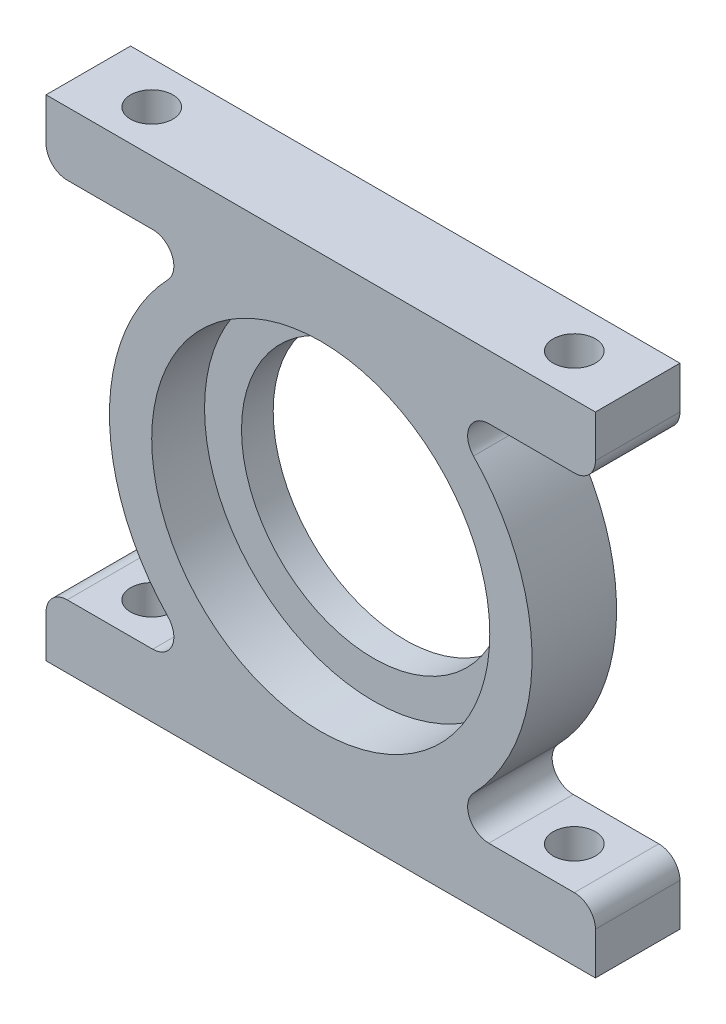
ISO-10303-21;
HEADER;
FILE_DESCRIPTION(('STEP AP214'),'2;1');
FILE_NAME('part.step','',(''),(''),'','','');
FILE_SCHEMA(('AUTOMOTIVE_DESIGN { 1 0 10303 214 1 1 1 1 }'));
ENDSEC;
DATA;
#1=APPLICATION_CONTEXT('core data for automotive mechanical design processes');
#2=APPLICATION_PROTOCOL_DEFINITION('international standard','automotive_design',2000,#1);
#3=PRODUCT_CONTEXT('',#1,'mechanical');
#4=PRODUCT('Part','Part','',(#3));
#5=PRODUCT_RELATED_PRODUCT_CATEGORY('part','',(#4));
#6=PRODUCT_DEFINITION_FORMATION('','',#4);
#7=PRODUCT_DEFINITION_CONTEXT('part definition',#1,'design');
#8=PRODUCT_DEFINITION('design','',#6,#7);
#9=PRODUCT_DEFINITION_SHAPE('','',#8);
#10=(LENGTH_UNIT() NAMED_UNIT(*) SI_UNIT(.MILLI.,.METRE.));
#11=(NAMED_UNIT(*) PLANE_ANGLE_UNIT() SI_UNIT($,.RADIAN.));
#12=(NAMED_UNIT(*) SI_UNIT($,.STERADIAN.) SOLID_ANGLE_UNIT());
#13=UNCERTAINTY_MEASURE_WITH_UNIT(LENGTH_MEASURE(1.E-05),#10,'distance_accuracy_value','');
#14=(GEOMETRIC_REPRESENTATION_CONTEXT(3) GLOBAL_UNCERTAINTY_ASSIGNED_CONTEXT((#13)) GLOBAL_UNIT_ASSIGNED_CONTEXT((#10,
#11,#12)) REPRESENTATION_CONTEXT('',''));
#15=CARTESIAN_POINT('',(0.,0.,0.));
#16=DIRECTION('',(0.,0.,1.));
#17=DIRECTION('',(1.,0.,0.));
#18=AXIS2_PLACEMENT_3D('',#15,#16,#17);
#19=CARTESIAN_POINT('',(0.,0.,8.));
#20=DIRECTION('',(0.,0.,-1.));
#21=DIRECTION('',(-1.,0.,0.));
#22=AXIS2_PLACEMENT_3D('',#19,#20,#21);
#23=CYLINDRICAL_SURFACE('',#22,16.);
#24=CARTESIAN_POINT('',(0.,0.,8.));
#25=DIRECTION('',(0.,0.,1.));
#26=DIRECTION('',(1.,0.,0.));
#27=AXIS2_PLACEMENT_3D('',#24,#25,#26);
#28=CIRCLE('',#27,16.);
#29=CARTESIAN_POINT('',(16.,0.,8.));
#30=VERTEX_POINT('',#29);
#31=EDGE_CURVE('E244',#30,#30,#28,.T.);
#32=ORIENTED_EDGE('',*,*,#31,.T.);
#33=EDGE_LOOP('',(#32));
#34=FACE_BOUND('',#33,.T.);
#35=CARTESIAN_POINT('',(0.,0.,3.));
#36=DIRECTION('',(0.,0.,-1.));
#37=DIRECTION('',(-1.,0.,0.));
#38=AXIS2_PLACEMENT_3D('',#35,#36,#37);
#39=CIRCLE('',#38,16.);
#40=CARTESIAN_POINT('',(-16.,0.,3.));
#41=VERTEX_POINT('',#40);
#42=EDGE_CURVE('E488',#41,#41,#39,.T.);
#43=ORIENTED_EDGE('',*,*,#42,.T.);
#44=EDGE_LOOP('',(#43));
#45=FACE_BOUND('',#44,.T.);
#46=ADVANCED_FACE('F44',(#34,#45),#23,.F.);
#47=CARTESIAN_POINT('',(0.,0.,8.));
#48=DIRECTION('',(0.,0.,1.));
#49=DIRECTION('',(1.,0.,0.));
#50=AXIS2_PLACEMENT_3D('',#47,#48,#49);
#51=PLANE('',#50);
#52=DIRECTION('',(-1.,0.,0.));
#53=VECTOR('',#52,1.);
#54=CARTESIAN_POINT('',(-26.,-17.2,8.));
#55=LINE('',#54,#53);
#56=CARTESIAN_POINT('',(-15.9047162816568,-17.2,8.));
#57=VERTEX_POINT('',#56);
#58=CARTESIAN_POINT('',(-24.,-17.2,8.));
#59=VERTEX_POINT('',#58);
#60=EDGE_CURVE('E229',#57,#59,#55,.T.);
#61=ORIENTED_EDGE('',*,*,#60,.T.);
#62=CARTESIAN_POINT('',(-24.,-19.2,8.));
#63=DIRECTION('',(0.,0.,1.));
#64=DIRECTION('',(1.,0.,0.));
#65=AXIS2_PLACEMENT_3D('',#62,#63,#64);
#66=CIRCLE('',#65,2.);
#67=CARTESIAN_POINT('',(-26.,-19.2,8.));
#68=VERTEX_POINT('',#67);
#69=EDGE_CURVE('E366',#59,#68,#66,.T.);
#70=ORIENTED_EDGE('',*,*,#69,.T.);
#71=DIRECTION('',(0.,-1.,0.));
#72=VECTOR('',#71,1.);
#73=CARTESIAN_POINT('',(-26.,-23.2,8.));
#74=LINE('',#73,#72);
#75=CARTESIAN_POINT('',(-26.,-23.2,8.));
#76=VERTEX_POINT('',#75);
#77=EDGE_CURVE('E226',#68,#76,#74,.T.);
#78=ORIENTED_EDGE('',*,*,#77,.T.);
#79=DIRECTION('',(1.,0.,0.));
#80=VECTOR('',#79,1.);
#81=CARTESIAN_POINT('',(-26.,-23.2,8.));
#82=LINE('',#81,#80);
#83=CARTESIAN_POINT('',(26.,-23.2,8.));
#84=VERTEX_POINT('',#83);
#85=EDGE_CURVE('E231',#76,#84,#82,.T.);
#86=ORIENTED_EDGE('',*,*,#85,.T.);
#87=DIRECTION('',(0.,1.,0.));
#88=VECTOR('',#87,1.);
#89=CARTESIAN_POINT('',(26.,-23.2,8.));
#90=LINE('',#89,#88);
#91=CARTESIAN_POINT('',(26.,-19.2,8.));
#92=VERTEX_POINT('',#91);
#93=EDGE_CURVE('E279',#84,#92,#90,.T.);
#94=ORIENTED_EDGE('',*,*,#93,.T.);
#95=CARTESIAN_POINT('',(24.,-19.2,8.));
#96=DIRECTION('',(0.,0.,1.));
#97=DIRECTION('',(1.,0.,0.));
#98=AXIS2_PLACEMENT_3D('',#95,#96,#97);
#99=CIRCLE('',#98,2.);
#100=CARTESIAN_POINT('',(24.,-17.2,8.));
#101=VERTEX_POINT('',#100);
#102=EDGE_CURVE('E364',#92,#101,#99,.T.);
#103=ORIENTED_EDGE('',*,*,#102,.T.);
#104=DIRECTION('',(-1.,0.,0.));
#105=VECTOR('',#104,1.);
#106=CARTESIAN_POINT('',(26.,-17.2,8.));
#107=LINE('',#106,#105);
#108=CARTESIAN_POINT('',(15.9047162816568,-17.2,8.));
#109=VERTEX_POINT('',#108);
#110=EDGE_CURVE('E434',#101,#109,#107,.T.);
#111=ORIENTED_EDGE('',*,*,#110,.T.);
#112=CARTESIAN_POINT('',(15.9047162816568,-15.2,8.));
#113=DIRECTION('',(0.,0.,1.));
#114=DIRECTION('',(1.,0.,0.));
#115=AXIS2_PLACEMENT_3D('',#112,#113,#114);
#116=CIRCLE('',#115,2.);
#117=CARTESIAN_POINT('',(14.4588329833244,-13.8181818181818,8.));
#118=VERTEX_POINT('',#117);
#119=EDGE_CURVE('E326',#109,#118,#116,.F.);
#120=ORIENTED_EDGE('',*,*,#119,.T.);
#121=CARTESIAN_POINT('',(0.,0.,8.));
#122=DIRECTION('',(0.,0.,1.));
#123=DIRECTION('',(1.,0.,0.));
#124=AXIS2_PLACEMENT_3D('',#121,#122,#123);
#125=CIRCLE('',#124,20.);
#126=CARTESIAN_POINT('',(14.4588329833244,13.8181818181818,8.));
#127=VERTEX_POINT('',#126);
#128=EDGE_CURVE('E451',#118,#127,#125,.T.);
#129=ORIENTED_EDGE('',*,*,#128,.T.);
#130=CARTESIAN_POINT('',(15.9047162816568,15.2,8.));
#131=DIRECTION('',(0.,0.,1.));
#132=DIRECTION('',(1.,0.,0.));
#133=AXIS2_PLACEMENT_3D('',#130,#131,#132);
#134=CIRCLE('',#133,2.);
#135=CARTESIAN_POINT('',(15.9047162816568,17.2,8.));
#136=VERTEX_POINT('',#135);
#137=EDGE_CURVE('E335',#127,#136,#134,.F.);
#138=ORIENTED_EDGE('',*,*,#137,.T.);
#139=DIRECTION('',(1.,0.,0.));
#140=VECTOR('',#139,1.);
#141=CARTESIAN_POINT('',(26.,17.2,8.));
#142=LINE('',#141,#140);
#143=CARTESIAN_POINT('',(24.,17.2,8.));
#144=VERTEX_POINT('',#143);
#145=EDGE_CURVE('E198',#136,#144,#142,.T.);
#146=ORIENTED_EDGE('',*,*,#145,.T.);
#147=CARTESIAN_POINT('',(24.,19.2,8.));
#148=DIRECTION('',(0.,0.,1.));
#149=DIRECTION('',(1.,0.,0.));
#150=AXIS2_PLACEMENT_3D('',#147,#148,#149);
#151=CIRCLE('',#150,2.);
#152=CARTESIAN_POINT('',(26.,19.2,8.));
#153=VERTEX_POINT('',#152);
#154=EDGE_CURVE('E193',#144,#153,#151,.T.);
#155=ORIENTED_EDGE('',*,*,#154,.T.);
#156=DIRECTION('',(0.,1.,0.));
#157=VECTOR('',#156,1.);
#158=CARTESIAN_POINT('',(26.,23.2,8.));
#159=LINE('',#158,#157);
#160=CARTESIAN_POINT('',(26.,23.2,8.));
#161=VERTEX_POINT('',#160);
#162=EDGE_CURVE('E182',#153,#161,#159,.T.);
#163=ORIENTED_EDGE('',*,*,#162,.T.);
#164=DIRECTION('',(-1.,0.,0.));
#165=VECTOR('',#164,1.);
#166=CARTESIAN_POINT('',(-26.,23.2,8.));
#167=LINE('',#166,#165);
#168=CARTESIAN_POINT('',(-26.,23.2,8.));
#169=VERTEX_POINT('',#168);
#170=EDGE_CURVE('E189',#161,#169,#167,.T.);
#171=ORIENTED_EDGE('',*,*,#170,.T.);
#172=DIRECTION('',(0.,-1.,0.));
#173=VECTOR('',#172,1.);
#174=CARTESIAN_POINT('',(-26.,23.2,8.));
#175=LINE('',#174,#173);
#176=CARTESIAN_POINT('',(-26.,19.2,8.));
#177=VERTEX_POINT('',#176);
#178=EDGE_CURVE('E215',#169,#177,#175,.T.);
#179=ORIENTED_EDGE('',*,*,#178,.T.);
#180=CARTESIAN_POINT('',(-24.,19.2,8.));
#181=DIRECTION('',(0.,0.,1.));
#182=DIRECTION('',(1.,0.,0.));
#183=AXIS2_PLACEMENT_3D('',#180,#181,#182);
#184=CIRCLE('',#183,2.);
#185=CARTESIAN_POINT('',(-24.,17.2,8.));
#186=VERTEX_POINT('',#185);
#187=EDGE_CURVE('E63',#177,#186,#184,.T.);
#188=ORIENTED_EDGE('',*,*,#187,.T.);
#189=DIRECTION('',(1.,0.,0.));
#190=VECTOR('',#189,1.);
#191=CARTESIAN_POINT('',(-26.,17.2,8.));
#192=LINE('',#191,#190);
#193=CARTESIAN_POINT('',(-15.9047162816568,17.2,8.));
#194=VERTEX_POINT('',#193);
#195=EDGE_CURVE('E220',#186,#194,#192,.T.);
#196=ORIENTED_EDGE('',*,*,#195,.T.);
#197=CARTESIAN_POINT('',(-15.9047162816568,15.2,8.));
#198=DIRECTION('',(0.,0.,1.));
#199=DIRECTION('',(1.,0.,0.));
#200=AXIS2_PLACEMENT_3D('',#197,#198,#199);
#201=CIRCLE('',#200,2.);
#202=CARTESIAN_POINT('',(-14.4588329833244,13.8181818181818,8.));
#203=VERTEX_POINT('',#202);
#204=EDGE_CURVE('E340',#194,#203,#201,.F.);
#205=ORIENTED_EDGE('',*,*,#204,.T.);
#206=CARTESIAN_POINT('',(0.,0.,8.));
#207=DIRECTION('',(0.,0.,1.));
#208=DIRECTION('',(1.,0.,0.));
#209=AXIS2_PLACEMENT_3D('',#206,#207,#208);
#210=CIRCLE('',#209,20.);
#211=CARTESIAN_POINT('',(-14.4588329833244,-13.8181818181818,8.));
#212=VERTEX_POINT('',#211);
#213=EDGE_CURVE('E224',#203,#212,#210,.T.);
#214=ORIENTED_EDGE('',*,*,#213,.T.);
#215=CARTESIAN_POINT('',(-15.9047162816568,-15.2,8.));
#216=DIRECTION('',(0.,0.,1.));
#217=DIRECTION('',(1.,0.,0.));
#218=AXIS2_PLACEMENT_3D('',#215,#216,#217);
#219=CIRCLE('',#218,2.);
#220=EDGE_CURVE('E317',#212,#57,#219,.F.);
#221=ORIENTED_EDGE('',*,*,#220,.T.);
#222=EDGE_LOOP('',(#61,#70,#78,#86,#94,#103,#111,#120,#129,#138,#146,#155,#163,#171,#179,#188,
#196,#205,#214,#221));
#223=FACE_BOUND('',#222,.T.);
#224=ORIENTED_EDGE('',*,*,#31,.F.);
#225=EDGE_LOOP('',(#224));
#226=FACE_BOUND('',#225,.T.);
#227=ADVANCED_FACE('F184',(#223,#226),#51,.T.);
#228=CARTESIAN_POINT('',(0.,0.,0.));
#229=DIRECTION('',(0.,0.,1.));
#230=DIRECTION('',(1.,0.,0.));
#231=AXIS2_PLACEMENT_3D('',#228,#229,#230);
#232=PLANE('',#231);
#233=DIRECTION('',(0.,-1.,0.));
#234=VECTOR('',#233,1.);
#235=CARTESIAN_POINT('',(-26.,-23.2,0.));
#236=LINE('',#235,#234);
#237=CARTESIAN_POINT('',(-26.,-19.2,0.));
#238=VERTEX_POINT('',#237);
#239=CARTESIAN_POINT('',(-26.,-23.2,0.));
#240=VERTEX_POINT('',#239);
#241=EDGE_CURVE('E275',#238,#240,#236,.T.);
#242=ORIENTED_EDGE('',*,*,#241,.F.);
#243=CARTESIAN_POINT('',(-24.,-19.2,0.));
#244=DIRECTION('',(0.,0.,1.));
#245=DIRECTION('',(1.,0.,0.));
#246=AXIS2_PLACEMENT_3D('',#243,#244,#245);
#247=CIRCLE('',#246,2.);
#248=CARTESIAN_POINT('',(-24.,-17.2,0.));
#249=VERTEX_POINT('',#248);
#250=EDGE_CURVE('E351',#238,#249,#247,.F.);
#251=ORIENTED_EDGE('',*,*,#250,.T.);
#252=DIRECTION('',(-1.,0.,0.));
#253=VECTOR('',#252,1.);
#254=CARTESIAN_POINT('',(-26.,-17.2,0.));
#255=LINE('',#254,#253);
#256=CARTESIAN_POINT('',(-15.9047162816568,-17.2,0.));
#257=VERTEX_POINT('',#256);
#258=EDGE_CURVE('E268',#257,#249,#255,.T.);
#259=ORIENTED_EDGE('',*,*,#258,.F.);
#260=CARTESIAN_POINT('',(-15.9047162816568,-15.2,0.));
#261=DIRECTION('',(0.,0.,1.));
#262=DIRECTION('',(1.,0.,0.));
#263=AXIS2_PLACEMENT_3D('',#260,#261,#262);
#264=CIRCLE('',#263,2.);
#265=CARTESIAN_POINT('',(-14.4588329833244,-13.8181818181818,0.));
#266=VERTEX_POINT('',#265);
#267=EDGE_CURVE('E320',#257,#266,#264,.T.);
#268=ORIENTED_EDGE('',*,*,#267,.T.);
#269=CARTESIAN_POINT('',(0.,0.,0.));
#270=DIRECTION('',(0.,0.,1.));
#271=DIRECTION('',(1.,0.,0.));
#272=AXIS2_PLACEMENT_3D('',#269,#270,#271);
#273=CIRCLE('',#272,20.);
#274=CARTESIAN_POINT('',(-14.4588329833244,13.8181818181818,0.));
#275=VERTEX_POINT('',#274);
#276=EDGE_CURVE('E262',#275,#266,#273,.T.);
#277=ORIENTED_EDGE('',*,*,#276,.F.);
#278=CARTESIAN_POINT('',(-15.9047162816568,15.2,0.));
#279=DIRECTION('',(0.,0.,1.));
#280=DIRECTION('',(1.,0.,0.));
#281=AXIS2_PLACEMENT_3D('',#278,#279,#280);
#282=CIRCLE('',#281,2.);
#283=CARTESIAN_POINT('',(-15.9047162816568,17.2,0.));
#284=VERTEX_POINT('',#283);
#285=EDGE_CURVE('E333',#275,#284,#282,.T.);
#286=ORIENTED_EDGE('',*,*,#285,.T.);
#287=DIRECTION('',(1.,0.,0.));
#288=VECTOR('',#287,1.);
#289=CARTESIAN_POINT('',(-26.,17.2,0.));
#290=LINE('',#289,#288);
#291=CARTESIAN_POINT('',(-24.,17.2,0.));
#292=VERTEX_POINT('',#291);
#293=EDGE_CURVE('E261',#292,#284,#290,.T.);
#294=ORIENTED_EDGE('',*,*,#293,.F.);
#295=CARTESIAN_POINT('',(-24.,19.2,0.));
#296=DIRECTION('',(0.,0.,1.));
#297=DIRECTION('',(1.,0.,0.));
#298=AXIS2_PLACEMENT_3D('',#295,#296,#297);
#299=CIRCLE('',#298,2.);
#300=CARTESIAN_POINT('',(-26.,19.2,0.));
#301=VERTEX_POINT('',#300);
#302=EDGE_CURVE('E347',#292,#301,#299,.F.);
#303=ORIENTED_EDGE('',*,*,#302,.T.);
#304=DIRECTION('',(0.,-1.,0.));
#305=VECTOR('',#304,1.);
#306=CARTESIAN_POINT('',(-26.,23.2,0.));
#307=LINE('',#306,#305);
#308=CARTESIAN_POINT('',(-26.,23.2,0.));
#309=VERTEX_POINT('',#308);
#310=EDGE_CURVE('E256',#309,#301,#307,.T.);
#311=ORIENTED_EDGE('',*,*,#310,.F.);
#312=DIRECTION('',(-1.,0.,0.));
#313=VECTOR('',#312,1.);
#314=CARTESIAN_POINT('',(-26.,23.2,0.));
#315=LINE('',#314,#313);
#316=CARTESIAN_POINT('',(26.,23.2,0.));
#317=VERTEX_POINT('',#316);
#318=EDGE_CURVE('E254',#317,#309,#315,.T.);
#319=ORIENTED_EDGE('',*,*,#318,.F.);
#320=DIRECTION('',(0.,1.,0.));
#321=VECTOR('',#320,1.);
#322=CARTESIAN_POINT('',(26.,23.2,0.));
#323=LINE('',#322,#321);
#324=CARTESIAN_POINT('',(26.,19.2,0.));
#325=VERTEX_POINT('',#324);
#326=EDGE_CURVE('E205',#325,#317,#323,.T.);
#327=ORIENTED_EDGE('',*,*,#326,.F.);
#328=CARTESIAN_POINT('',(24.,19.2,0.));
#329=DIRECTION('',(0.,0.,1.));
#330=DIRECTION('',(1.,0.,0.));
#331=AXIS2_PLACEMENT_3D('',#328,#329,#330);
#332=CIRCLE('',#331,2.);
#333=CARTESIAN_POINT('',(24.,17.2,0.));
#334=VERTEX_POINT('',#333);
#335=EDGE_CURVE('E349',#325,#334,#332,.F.);
#336=ORIENTED_EDGE('',*,*,#335,.T.);
#337=DIRECTION('',(1.,0.,0.));
#338=VECTOR('',#337,1.);
#339=CARTESIAN_POINT('',(26.,17.2,0.));
#340=LINE('',#339,#338);
#341=CARTESIAN_POINT('',(15.9047162816568,17.2,0.));
#342=VERTEX_POINT('',#341);
#343=EDGE_CURVE('E249',#342,#334,#340,.T.);
#344=ORIENTED_EDGE('',*,*,#343,.F.);
#345=CARTESIAN_POINT('',(15.9047162816568,15.2,0.));
#346=DIRECTION('',(0.,0.,1.));
#347=DIRECTION('',(1.,0.,0.));
#348=AXIS2_PLACEMENT_3D('',#345,#346,#347);
#349=CIRCLE('',#348,2.);
#350=CARTESIAN_POINT('',(14.4588329833244,13.8181818181818,0.));
#351=VERTEX_POINT('',#350);
#352=EDGE_CURVE('E328',#342,#351,#349,.T.);
#353=ORIENTED_EDGE('',*,*,#352,.T.);
#354=CARTESIAN_POINT('',(0.,0.,0.));
#355=DIRECTION('',(0.,0.,1.));
#356=DIRECTION('',(1.,0.,0.));
#357=AXIS2_PLACEMENT_3D('',#354,#355,#356);
#358=CIRCLE('',#357,20.);
#359=CARTESIAN_POINT('',(14.4588329833244,-13.8181818181818,0.));
#360=VERTEX_POINT('',#359);
#361=EDGE_CURVE('E241',#360,#351,#358,.T.);
#362=ORIENTED_EDGE('',*,*,#361,.F.);
#363=CARTESIAN_POINT('',(15.9047162816568,-15.2,0.));
#364=DIRECTION('',(0.,0.,1.));
#365=DIRECTION('',(1.,0.,0.));
#366=AXIS2_PLACEMENT_3D('',#363,#364,#365);
#367=CIRCLE('',#366,2.);
#368=CARTESIAN_POINT('',(15.9047162816568,-17.2,0.));
#369=VERTEX_POINT('',#368);
#370=EDGE_CURVE('E325',#360,#369,#367,.T.);
#371=ORIENTED_EDGE('',*,*,#370,.T.);
#372=DIRECTION('',(-1.,0.,0.));
#373=VECTOR('',#372,1.);
#374=CARTESIAN_POINT('',(26.,-17.2,0.));
#375=LINE('',#374,#373);
#376=CARTESIAN_POINT('',(24.,-17.2,0.));
#377=VERTEX_POINT('',#376);
#378=EDGE_CURVE('E243',#377,#369,#375,.T.);
#379=ORIENTED_EDGE('',*,*,#378,.F.);
#380=CARTESIAN_POINT('',(24.,-19.2,0.));
#381=DIRECTION('',(0.,0.,1.));
#382=DIRECTION('',(1.,0.,0.));
#383=AXIS2_PLACEMENT_3D('',#380,#381,#382);
#384=CIRCLE('',#383,2.);
#385=CARTESIAN_POINT('',(26.,-19.2,0.));
#386=VERTEX_POINT('',#385);
#387=EDGE_CURVE('E354',#377,#386,#384,.F.);
#388=ORIENTED_EDGE('',*,*,#387,.T.);
#389=DIRECTION('',(0.,1.,0.));
#390=VECTOR('',#389,1.);
#391=CARTESIAN_POINT('',(26.,-23.2,0.));
#392=LINE('',#391,#390);
#393=CARTESIAN_POINT('',(26.,-23.2,0.));
#394=VERTEX_POINT('',#393);
#395=EDGE_CURVE('E240',#394,#386,#392,.T.);
#396=ORIENTED_EDGE('',*,*,#395,.F.);
#397=DIRECTION('',(1.,0.,0.));
#398=VECTOR('',#397,1.);
#399=CARTESIAN_POINT('',(-26.,-23.2,0.));
#400=LINE('',#399,#398);
#401=EDGE_CURVE('E274',#240,#394,#400,.T.);
#402=ORIENTED_EDGE('',*,*,#401,.F.);
#403=EDGE_LOOP('',(#242,#251,#259,#268,#277,#286,#294,#303,#311,#319,#327,#336,#344,#353,#362,
#371,#379,#388,#396,#402));
#404=FACE_BOUND('',#403,.T.);
#405=CARTESIAN_POINT('',(0.,0.,0.));
#406=DIRECTION('',(0.,0.,-1.));
#407=DIRECTION('',(-1.,0.,0.));
#408=AXIS2_PLACEMENT_3D('',#405,#406,#407);
#409=CIRCLE('',#408,12.5);
#410=CARTESIAN_POINT('',(-12.5,0.,0.));
#411=VERTEX_POINT('',#410);
#412=EDGE_CURVE('E503',#411,#411,#409,.T.);
#413=ORIENTED_EDGE('',*,*,#412,.F.);
#414=EDGE_LOOP('',(#413));
#415=FACE_BOUND('',#414,.T.);
#416=ADVANCED_FACE('F395',(#404,#415),#232,.F.);
#417=CARTESIAN_POINT('',(26.,-23.2,8.));
#418=DIRECTION('',(-1.,0.,0.));
#419=DIRECTION('',(0.,-1.,0.));
#420=AXIS2_PLACEMENT_3D('',#417,#418,#419);
#421=PLANE('',#420);
#422=ORIENTED_EDGE('',*,*,#395,.T.);
#423=DIRECTION('',(0.,0.,-1.));
#424=VECTOR('',#423,1.);
#425=CARTESIAN_POINT('',(26.,-19.2,8.));
#426=LINE('',#425,#424);
#427=EDGE_CURVE('E374',#386,#92,#426,.F.);
#428=ORIENTED_EDGE('',*,*,#427,.T.);
#429=ORIENTED_EDGE('',*,*,#93,.F.);
#430=DIRECTION('',(0.,0.,-1.));
#431=VECTOR('',#430,1.);
#432=CARTESIAN_POINT('',(26.,-23.2,8.));
#433=LINE('',#432,#431);
#434=EDGE_CURVE('E237',#84,#394,#433,.T.);
#435=ORIENTED_EDGE('',*,*,#434,.T.);
#436=EDGE_LOOP('',(#422,#428,#429,#435));
#437=FACE_BOUND('',#436,.T.);
#438=ADVANCED_FACE('F517',(#437),#421,.F.);
#439=CARTESIAN_POINT('',(26.,-17.2,8.));
#440=DIRECTION('',(0.,-1.,0.));
#441=DIRECTION('',(1.,0.,0.));
#442=AXIS2_PLACEMENT_3D('',#439,#440,#441);
#443=PLANE('',#442);
#444=CARTESIAN_POINT('',(20.,-17.2,3.99999999999997));
#445=DIRECTION('',(0.,-1.,0.));
#446=DIRECTION('',(1.,0.,0.));
#447=AXIS2_PLACEMENT_3D('',#444,#445,#446);
#448=CIRCLE('',#447,2.);
#449=CARTESIAN_POINT('',(22.,-17.2,3.99999999999997));
#450=VERTEX_POINT('',#449);
#451=EDGE_CURVE('E472',#450,#450,#448,.T.);
#452=ORIENTED_EDGE('',*,*,#451,.T.);
#453=EDGE_LOOP('',(#452));
#454=FACE_BOUND('',#453,.T.);
#455=ORIENTED_EDGE('',*,*,#110,.F.);
#456=DIRECTION('',(0.,0.,-1.));
#457=VECTOR('',#456,1.);
#458=CARTESIAN_POINT('',(24.,-17.2,8.));
#459=LINE('',#458,#457);
#460=EDGE_CURVE('E371',#101,#377,#459,.T.);
#461=ORIENTED_EDGE('',*,*,#460,.T.);
#462=ORIENTED_EDGE('',*,*,#378,.T.);
#463=DIRECTION('',(0.,0.,1.));
#464=VECTOR('',#463,1.);
#465=CARTESIAN_POINT('',(15.9047162816568,-17.2,8.));
#466=LINE('',#465,#464);
#467=EDGE_CURVE('E302',#369,#109,#466,.T.);
#468=ORIENTED_EDGE('',*,*,#467,.T.);
#469=EDGE_LOOP('',(#455,#461,#462,#468));
#470=FACE_BOUND('',#469,.T.);
#471=ADVANCED_FACE('F444',(#454,#470),#443,.F.);
#472=CARTESIAN_POINT('',(0.,0.,8.));
#473=DIRECTION('',(0.,0.,-1.));
#474=DIRECTION('',(-1.,0.,0.));
#475=AXIS2_PLACEMENT_3D('',#472,#473,#474);
#476=CYLINDRICAL_SURFACE('',#475,20.);
#477=ORIENTED_EDGE('',*,*,#128,.F.);
#478=DIRECTION('',(0.,0.,-1.));
#479=VECTOR('',#478,1.);
#480=CARTESIAN_POINT('',(14.4588329833244,-13.8181818181818,8.));
#481=LINE('',#480,#479);
#482=EDGE_CURVE('E303',#118,#360,#481,.T.);
#483=ORIENTED_EDGE('',*,*,#482,.T.);
#484=ORIENTED_EDGE('',*,*,#361,.T.);
#485=DIRECTION('',(0.,0.,-1.));
#486=VECTOR('',#485,1.);
#487=CARTESIAN_POINT('',(14.4588329833244,13.8181818181818,8.));
#488=LINE('',#487,#486);
#489=EDGE_CURVE('E297',#351,#127,#488,.F.);
#490=ORIENTED_EDGE('',*,*,#489,.T.);
#491=EDGE_LOOP('',(#477,#483,#484,#490));
#492=FACE_BOUND('',#491,.T.);
#493=ADVANCED_FACE('F457',(#492),#476,.T.);
#494=CARTESIAN_POINT('',(26.,17.2,8.));
#495=DIRECTION('',(0.,1.,0.));
#496=DIRECTION('',(0.,0.,1.));
#497=AXIS2_PLACEMENT_3D('',#494,#495,#496);
#498=PLANE('',#497);
#499=CARTESIAN_POINT('',(20.,17.2,3.99999999999997));
#500=DIRECTION('',(0.,1.,0.));
#501=DIRECTION('',(0.,0.,-1.));
#502=AXIS2_PLACEMENT_3D('',#499,#500,#501);
#503=CIRCLE('',#502,2.);
#504=CARTESIAN_POINT('',(20.,17.2,1.99999999999996));
#505=VERTEX_POINT('',#504);
#506=EDGE_CURVE('E473',#505,#505,#503,.T.);
#507=ORIENTED_EDGE('',*,*,#506,.T.);
#508=EDGE_LOOP('',(#507));
#509=FACE_BOUND('',#508,.T.);
#510=ORIENTED_EDGE('',*,*,#343,.T.);
#511=DIRECTION('',(0.,0.,-1.));
#512=VECTOR('',#511,1.);
#513=CARTESIAN_POINT('',(24.,17.2,8.));
#514=LINE('',#513,#512);
#515=EDGE_CURVE('E381',#334,#144,#514,.F.);
#516=ORIENTED_EDGE('',*,*,#515,.T.);
#517=ORIENTED_EDGE('',*,*,#145,.F.);
#518=DIRECTION('',(0.,0.,1.));
#519=VECTOR('',#518,1.);
#520=CARTESIAN_POINT('',(15.9047162816568,17.2,0.));
#521=LINE('',#520,#519);
#522=EDGE_CURVE('E310',#136,#342,#521,.F.);
#523=ORIENTED_EDGE('',*,*,#522,.T.);
#524=EDGE_LOOP('',(#510,#516,#517,#523));
#525=FACE_BOUND('',#524,.T.);
#526=ADVANCED_FACE('F578',(#509,#525),#498,.F.);
#527=CARTESIAN_POINT('',(26.,23.2,8.));
#528=DIRECTION('',(-1.,0.,0.));
#529=DIRECTION('',(0.,0.,1.));
#530=AXIS2_PLACEMENT_3D('',#527,#528,#529);
#531=PLANE('',#530);
#532=ORIENTED_EDGE('',*,*,#162,.F.);
#533=DIRECTION('',(0.,0.,-1.));
#534=VECTOR('',#533,1.);
#535=CARTESIAN_POINT('',(26.,19.2,8.));
#536=LINE('',#535,#534);
#537=EDGE_CURVE('E378',#153,#325,#536,.T.);
#538=ORIENTED_EDGE('',*,*,#537,.T.);
#539=ORIENTED_EDGE('',*,*,#326,.T.);
#540=DIRECTION('',(0.,0.,-1.));
#541=VECTOR('',#540,1.);
#542=CARTESIAN_POINT('',(26.,23.2,8.));
#543=LINE('',#542,#541);
#544=EDGE_CURVE('E200',#161,#317,#543,.T.);
#545=ORIENTED_EDGE('',*,*,#544,.F.);
#546=EDGE_LOOP('',(#532,#538,#539,#545));
#547=FACE_BOUND('',#546,.T.);
#548=ADVANCED_FACE('F199',(#547),#531,.F.);
#549=CARTESIAN_POINT('',(-26.,23.2,8.));
#550=DIRECTION('',(0.,-1.,0.));
#551=DIRECTION('',(0.,0.,-1.));
#552=AXIS2_PLACEMENT_3D('',#549,#550,#551);
#553=PLANE('',#552);
#554=CARTESIAN_POINT('',(-20.,23.2,4.));
#555=DIRECTION('',(0.,1.,0.));
#556=DIRECTION('',(0.,0.,1.));
#557=AXIS2_PLACEMENT_3D('',#554,#555,#556);
#558=CIRCLE('',#557,2.);
#559=CARTESIAN_POINT('',(-20.,23.2,6.));
#560=VERTEX_POINT('',#559);
#561=EDGE_CURVE('E478',#560,#560,#558,.T.);
#562=ORIENTED_EDGE('',*,*,#561,.F.);
#563=EDGE_LOOP('',(#562));
#564=FACE_BOUND('',#563,.T.);
#565=CARTESIAN_POINT('',(20.,23.2,3.99999999999997));
#566=DIRECTION('',(0.,1.,0.));
#567=DIRECTION('',(0.,0.,-1.));
#568=AXIS2_PLACEMENT_3D('',#565,#566,#567);
#569=CIRCLE('',#568,2.);
#570=CARTESIAN_POINT('',(20.,23.2,1.99999999999996));
#571=VERTEX_POINT('',#570);
#572=EDGE_CURVE('E470',#571,#571,#569,.T.);
#573=ORIENTED_EDGE('',*,*,#572,.F.);
#574=EDGE_LOOP('',(#573));
#575=FACE_BOUND('',#574,.T.);
#576=ORIENTED_EDGE('',*,*,#318,.T.);
#577=DIRECTION('',(0.,0.,-1.));
#578=VECTOR('',#577,1.);
#579=CARTESIAN_POINT('',(-26.,23.2,8.));
#580=LINE('',#579,#578);
#581=EDGE_CURVE('E210',#169,#309,#580,.T.);
#582=ORIENTED_EDGE('',*,*,#581,.F.);
#583=ORIENTED_EDGE('',*,*,#170,.F.);
#584=ORIENTED_EDGE('',*,*,#544,.T.);
#585=EDGE_LOOP('',(#576,#582,#583,#584));
#586=FACE_BOUND('',#585,.T.);
#587=ADVANCED_FACE('F207',(#564,#575,#586),#553,.F.);
#588=CARTESIAN_POINT('',(-26.,23.2,8.));
#589=DIRECTION('',(1.,0.,0.));
#590=DIRECTION('',(0.,0.,-1.));
#591=AXIS2_PLACEMENT_3D('',#588,#589,#590);
#592=PLANE('',#591);
#593=ORIENTED_EDGE('',*,*,#310,.T.);
#594=DIRECTION('',(0.,0.,-1.));
#595=VECTOR('',#594,1.);
#596=CARTESIAN_POINT('',(-26.,19.2,8.));
#597=LINE('',#596,#595);
#598=EDGE_CURVE('E11',#301,#177,#597,.F.);
#599=ORIENTED_EDGE('',*,*,#598,.T.);
#600=ORIENTED_EDGE('',*,*,#178,.F.);
#601=ORIENTED_EDGE('',*,*,#581,.T.);
#602=EDGE_LOOP('',(#593,#599,#600,#601));
#603=FACE_BOUND('',#602,.T.);
#604=ADVANCED_FACE('F585',(#603),#592,.F.);
#605=CARTESIAN_POINT('',(-26.,17.2,8.));
#606=DIRECTION('',(0.,1.,0.));
#607=DIRECTION('',(0.,0.,1.));
#608=AXIS2_PLACEMENT_3D('',#605,#606,#607);
#609=PLANE('',#608);
#610=CARTESIAN_POINT('',(-20.,17.2,4.));
#611=DIRECTION('',(0.,1.,0.));
#612=DIRECTION('',(0.,0.,1.));
#613=AXIS2_PLACEMENT_3D('',#610,#611,#612);
#614=CIRCLE('',#613,2.);
#615=CARTESIAN_POINT('',(-20.,17.2,6.));
#616=VERTEX_POINT('',#615);
#617=EDGE_CURVE('E468',#616,#616,#614,.T.);
#618=ORIENTED_EDGE('',*,*,#617,.T.);
#619=EDGE_LOOP('',(#618));
#620=FACE_BOUND('',#619,.T.);
#621=ORIENTED_EDGE('',*,*,#195,.F.);
#622=DIRECTION('',(0.,0.,-1.));
#623=VECTOR('',#622,1.);
#624=CARTESIAN_POINT('',(-24.,17.2,8.));
#625=LINE('',#624,#623);
#626=EDGE_CURVE('E53',#186,#292,#625,.T.);
#627=ORIENTED_EDGE('',*,*,#626,.T.);
#628=ORIENTED_EDGE('',*,*,#293,.T.);
#629=DIRECTION('',(0.,0.,1.));
#630=VECTOR('',#629,1.);
#631=CARTESIAN_POINT('',(-15.9047162816568,17.2,8.));
#632=LINE('',#631,#630);
#633=EDGE_CURVE('E311',#284,#194,#632,.T.);
#634=ORIENTED_EDGE('',*,*,#633,.T.);
#635=EDGE_LOOP('',(#621,#627,#628,#634));
#636=FACE_BOUND('',#635,.T.);
#637=ADVANCED_FACE('F388',(#620,#636),#609,.F.);
#638=CARTESIAN_POINT('',(0.,0.,8.));
#639=DIRECTION('',(0.,0.,-1.));
#640=DIRECTION('',(-1.,0.,0.));
#641=AXIS2_PLACEMENT_3D('',#638,#639,#640);
#642=CYLINDRICAL_SURFACE('',#641,20.);
#643=ORIENTED_EDGE('',*,*,#276,.T.);
#644=DIRECTION('',(0.,0.,-1.));
#645=VECTOR('',#644,1.);
#646=CARTESIAN_POINT('',(-14.4588329833244,-13.8181818181818,8.));
#647=LINE('',#646,#645);
#648=EDGE_CURVE('E293',#266,#212,#647,.F.);
#649=ORIENTED_EDGE('',*,*,#648,.T.);
#650=ORIENTED_EDGE('',*,*,#213,.F.);
#651=DIRECTION('',(0.,0.,-1.));
#652=VECTOR('',#651,1.);
#653=CARTESIAN_POINT('',(-14.4588329833244,13.8181818181818,8.));
#654=LINE('',#653,#652);
#655=EDGE_CURVE('E292',#203,#275,#654,.T.);
#656=ORIENTED_EDGE('',*,*,#655,.T.);
#657=EDGE_LOOP('',(#643,#649,#650,#656));
#658=FACE_BOUND('',#657,.T.);
#659=ADVANCED_FACE('F408',(#658),#642,.T.);
#660=CARTESIAN_POINT('',(-26.,-17.2,8.));
#661=DIRECTION('',(0.,-1.,0.));
#662=DIRECTION('',(1.,0.,0.));
#663=AXIS2_PLACEMENT_3D('',#660,#661,#662);
#664=PLANE('',#663);
#665=CARTESIAN_POINT('',(-20.,-17.2,4.));
#666=DIRECTION('',(0.,-1.,0.));
#667=DIRECTION('',(1.,0.,0.));
#668=AXIS2_PLACEMENT_3D('',#665,#666,#667);
#669=CIRCLE('',#668,2.);
#670=CARTESIAN_POINT('',(-18.,-17.2,4.));
#671=VERTEX_POINT('',#670);
#672=EDGE_CURVE('E490',#671,#671,#669,.T.);
#673=ORIENTED_EDGE('',*,*,#672,.T.);
#674=EDGE_LOOP('',(#673));
#675=FACE_BOUND('',#674,.T.);
#676=ORIENTED_EDGE('',*,*,#258,.T.);
#677=DIRECTION('',(0.,0.,-1.));
#678=VECTOR('',#677,1.);
#679=CARTESIAN_POINT('',(-24.,-17.2,8.));
#680=LINE('',#679,#678);
#681=EDGE_CURVE('E356',#249,#59,#680,.F.);
#682=ORIENTED_EDGE('',*,*,#681,.T.);
#683=ORIENTED_EDGE('',*,*,#60,.F.);
#684=DIRECTION('',(0.,0.,1.));
#685=VECTOR('',#684,1.);
#686=CARTESIAN_POINT('',(-15.9047162816568,-17.2,0.));
#687=LINE('',#686,#685);
#688=EDGE_CURVE('E206',#57,#257,#687,.F.);
#689=ORIENTED_EDGE('',*,*,#688,.T.);
#690=EDGE_LOOP('',(#676,#682,#683,#689));
#691=FACE_BOUND('',#690,.T.);
#692=ADVANCED_FACE('F414',(#675,#691),#664,.F.);
#693=CARTESIAN_POINT('',(-26.,-23.2,8.));
#694=DIRECTION('',(1.,0.,0.));
#695=DIRECTION('',(0.,1.,0.));
#696=AXIS2_PLACEMENT_3D('',#693,#694,#695);
#697=PLANE('',#696);
#698=ORIENTED_EDGE('',*,*,#77,.F.);
#699=DIRECTION('',(0.,0.,-1.));
#700=VECTOR('',#699,1.);
#701=CARTESIAN_POINT('',(-26.,-19.2,8.));
#702=LINE('',#701,#700);
#703=EDGE_CURVE('E345',#68,#238,#702,.T.);
#704=ORIENTED_EDGE('',*,*,#703,.T.);
#705=ORIENTED_EDGE('',*,*,#241,.T.);
#706=DIRECTION('',(0.,0.,-1.));
#707=VECTOR('',#706,1.);
#708=CARTESIAN_POINT('',(-26.,-23.2,8.));
#709=LINE('',#708,#707);
#710=EDGE_CURVE('E284',#76,#240,#709,.T.);
#711=ORIENTED_EDGE('',*,*,#710,.F.);
#712=EDGE_LOOP('',(#698,#704,#705,#711));
#713=FACE_BOUND('',#712,.T.);
#714=ADVANCED_FACE('F421',(#713),#697,.F.);
#715=CARTESIAN_POINT('',(-26.,-23.2,8.));
#716=DIRECTION('',(0.,1.,0.));
#717=DIRECTION('',(-1.,0.,0.));
#718=AXIS2_PLACEMENT_3D('',#715,#716,#717);
#719=PLANE('',#718);
#720=CARTESIAN_POINT('',(20.,-23.2,3.99999999999997));
#721=DIRECTION('',(0.,-1.,0.));
#722=DIRECTION('',(1.,0.,0.));
#723=AXIS2_PLACEMENT_3D('',#720,#721,#722);
#724=CIRCLE('',#723,2.);
#725=CARTESIAN_POINT('',(22.,-23.2,3.99999999999997));
#726=VERTEX_POINT('',#725);
#727=EDGE_CURVE('E495',#726,#726,#724,.T.);
#728=ORIENTED_EDGE('',*,*,#727,.F.);
#729=EDGE_LOOP('',(#728));
#730=FACE_BOUND('',#729,.T.);
#731=CARTESIAN_POINT('',(-20.,-23.2,4.));
#732=DIRECTION('',(0.,-1.,0.));
#733=DIRECTION('',(1.,0.,0.));
#734=AXIS2_PLACEMENT_3D('',#731,#732,#733);
#735=CIRCLE('',#734,2.);
#736=CARTESIAN_POINT('',(-18.,-23.2,4.));
#737=VERTEX_POINT('',#736);
#738=EDGE_CURVE('E483',#737,#737,#735,.T.);
#739=ORIENTED_EDGE('',*,*,#738,.F.);
#740=EDGE_LOOP('',(#739));
#741=FACE_BOUND('',#740,.T.);
#742=ORIENTED_EDGE('',*,*,#401,.T.);
#743=ORIENTED_EDGE('',*,*,#434,.F.);
#744=ORIENTED_EDGE('',*,*,#85,.F.);
#745=ORIENTED_EDGE('',*,*,#710,.T.);
#746=EDGE_LOOP('',(#742,#743,#744,#745));
#747=FACE_BOUND('',#746,.T.);
#748=ADVANCED_FACE('F428',(#730,#741,#747),#719,.F.);
#749=CARTESIAN_POINT('',(-20.,17.2,4.));
#750=DIRECTION('',(0.,1.,0.));
#751=DIRECTION('',(0.,0.,1.));
#752=AXIS2_PLACEMENT_3D('',#749,#750,#751);
#753=CYLINDRICAL_SURFACE('',#752,2.);
#754=ORIENTED_EDGE('',*,*,#617,.F.);
#755=EDGE_LOOP('',(#754));
#756=FACE_BOUND('',#755,.T.);
#757=ORIENTED_EDGE('',*,*,#561,.T.);
#758=EDGE_LOOP('',(#757));
#759=FACE_BOUND('',#758,.T.);
#760=ADVANCED_FACE('F536',(#756,#759),#753,.F.);
#761=CARTESIAN_POINT('',(20.,17.2,3.99999999999997));
#762=DIRECTION('',(0.,1.,0.));
#763=DIRECTION('',(0.,0.,1.));
#764=AXIS2_PLACEMENT_3D('',#761,#762,#763);
#765=CYLINDRICAL_SURFACE('',#764,2.);
#766=ORIENTED_EDGE('',*,*,#506,.F.);
#767=EDGE_LOOP('',(#766));
#768=FACE_BOUND('',#767,.T.);
#769=ORIENTED_EDGE('',*,*,#572,.T.);
#770=EDGE_LOOP('',(#769));
#771=FACE_BOUND('',#770,.T.);
#772=ADVANCED_FACE('F535',(#768,#771),#765,.F.);
#773=CARTESIAN_POINT('',(-20.,-17.2,4.));
#774=DIRECTION('',(0.,-1.,0.));
#775=DIRECTION('',(1.,0.,0.));
#776=AXIS2_PLACEMENT_3D('',#773,#774,#775);
#777=CYLINDRICAL_SURFACE('',#776,2.);
#778=ORIENTED_EDGE('',*,*,#672,.F.);
#779=EDGE_LOOP('',(#778));
#780=FACE_BOUND('',#779,.T.);
#781=ORIENTED_EDGE('',*,*,#738,.T.);
#782=EDGE_LOOP('',(#781));
#783=FACE_BOUND('',#782,.T.);
#784=ADVANCED_FACE('F532',(#780,#783),#777,.F.);
#785=CARTESIAN_POINT('',(20.,-17.2,3.99999999999997));
#786=DIRECTION('',(0.,-1.,0.));
#787=DIRECTION('',(1.,0.,0.));
#788=AXIS2_PLACEMENT_3D('',#785,#786,#787);
#789=CYLINDRICAL_SURFACE('',#788,2.);
#790=ORIENTED_EDGE('',*,*,#451,.F.);
#791=EDGE_LOOP('',(#790));
#792=FACE_BOUND('',#791,.T.);
#793=ORIENTED_EDGE('',*,*,#727,.T.);
#794=EDGE_LOOP('',(#793));
#795=FACE_BOUND('',#794,.T.);
#796=ADVANCED_FACE('F543',(#792,#795),#789,.F.);
#797=CARTESIAN_POINT('',(-15.9047162816568,-15.2,8.));
#798=DIRECTION('',(0.,0.,-1.));
#799=DIRECTION('',(-1.,0.,0.));
#800=AXIS2_PLACEMENT_3D('',#797,#798,#799);
#801=CYLINDRICAL_SURFACE('',#800,2.);
#802=ORIENTED_EDGE('',*,*,#220,.F.);
#803=ORIENTED_EDGE('',*,*,#648,.F.);
#804=ORIENTED_EDGE('',*,*,#267,.F.);
#805=ORIENTED_EDGE('',*,*,#688,.F.);
#806=EDGE_LOOP('',(#802,#803,#804,#805));
#807=FACE_BOUND('',#806,.T.);
#808=ADVANCED_FACE('F410',(#807),#801,.F.);
#809=CARTESIAN_POINT('',(15.9047162816568,-15.2,8.));
#810=DIRECTION('',(0.,0.,-1.));
#811=DIRECTION('',(-1.,0.,0.));
#812=AXIS2_PLACEMENT_3D('',#809,#810,#811);
#813=CYLINDRICAL_SURFACE('',#812,2.);
#814=ORIENTED_EDGE('',*,*,#119,.F.);
#815=ORIENTED_EDGE('',*,*,#467,.F.);
#816=ORIENTED_EDGE('',*,*,#370,.F.);
#817=ORIENTED_EDGE('',*,*,#482,.F.);
#818=EDGE_LOOP('',(#814,#815,#816,#817));
#819=FACE_BOUND('',#818,.T.);
#820=ADVANCED_FACE('F446',(#819),#813,.F.);
#821=CARTESIAN_POINT('',(15.9047162816568,15.2,8.));
#822=DIRECTION('',(0.,0.,-1.));
#823=DIRECTION('',(-1.,0.,0.));
#824=AXIS2_PLACEMENT_3D('',#821,#822,#823);
#825=CYLINDRICAL_SURFACE('',#824,2.);
#826=ORIENTED_EDGE('',*,*,#137,.F.);
#827=ORIENTED_EDGE('',*,*,#489,.F.);
#828=ORIENTED_EDGE('',*,*,#352,.F.);
#829=ORIENTED_EDGE('',*,*,#522,.F.);
#830=EDGE_LOOP('',(#826,#827,#828,#829));
#831=FACE_BOUND('',#830,.T.);
#832=ADVANCED_FACE('F561',(#831),#825,.F.);
#833=CARTESIAN_POINT('',(-15.9047162816568,15.2,8.));
#834=DIRECTION('',(0.,0.,-1.));
#835=DIRECTION('',(-1.,0.,0.));
#836=AXIS2_PLACEMENT_3D('',#833,#834,#835);
#837=CYLINDRICAL_SURFACE('',#836,2.);
#838=ORIENTED_EDGE('',*,*,#204,.F.);
#839=ORIENTED_EDGE('',*,*,#633,.F.);
#840=ORIENTED_EDGE('',*,*,#285,.F.);
#841=ORIENTED_EDGE('',*,*,#655,.F.);
#842=EDGE_LOOP('',(#838,#839,#840,#841));
#843=FACE_BOUND('',#842,.T.);
#844=ADVANCED_FACE('F405',(#843),#837,.F.);
#845=CARTESIAN_POINT('',(-24.,-19.2,8.));
#846=DIRECTION('',(0.,0.,-1.));
#847=DIRECTION('',(-1.,0.,0.));
#848=AXIS2_PLACEMENT_3D('',#845,#846,#847);
#849=CYLINDRICAL_SURFACE('',#848,2.);
#850=ORIENTED_EDGE('',*,*,#69,.F.);
#851=ORIENTED_EDGE('',*,*,#681,.F.);
#852=ORIENTED_EDGE('',*,*,#250,.F.);
#853=ORIENTED_EDGE('',*,*,#703,.F.);
#854=EDGE_LOOP('',(#850,#851,#852,#853));
#855=FACE_BOUND('',#854,.T.);
#856=ADVANCED_FACE('F416',(#855),#849,.T.);
#857=CARTESIAN_POINT('',(24.,-19.2,8.));
#858=DIRECTION('',(0.,0.,-1.));
#859=DIRECTION('',(-1.,0.,0.));
#860=AXIS2_PLACEMENT_3D('',#857,#858,#859);
#861=CYLINDRICAL_SURFACE('',#860,2.);
#862=ORIENTED_EDGE('',*,*,#102,.F.);
#863=ORIENTED_EDGE('',*,*,#427,.F.);
#864=ORIENTED_EDGE('',*,*,#387,.F.);
#865=ORIENTED_EDGE('',*,*,#460,.F.);
#866=EDGE_LOOP('',(#862,#863,#864,#865));
#867=FACE_BOUND('',#866,.T.);
#868=ADVANCED_FACE('F439',(#867),#861,.T.);
#869=CARTESIAN_POINT('',(24.,19.2,8.));
#870=DIRECTION('',(0.,0.,-1.));
#871=DIRECTION('',(-1.,0.,0.));
#872=AXIS2_PLACEMENT_3D('',#869,#870,#871);
#873=CYLINDRICAL_SURFACE('',#872,2.);
#874=ORIENTED_EDGE('',*,*,#154,.F.);
#875=ORIENTED_EDGE('',*,*,#515,.F.);
#876=ORIENTED_EDGE('',*,*,#335,.F.);
#877=ORIENTED_EDGE('',*,*,#537,.F.);
#878=EDGE_LOOP('',(#874,#875,#876,#877));
#879=FACE_BOUND('',#878,.T.);
#880=ADVANCED_FACE('F552',(#879),#873,.T.);
#881=CARTESIAN_POINT('',(-24.,19.2,8.));
#882=DIRECTION('',(0.,0.,-1.));
#883=DIRECTION('',(-1.,0.,0.));
#884=AXIS2_PLACEMENT_3D('',#881,#882,#883);
#885=CYLINDRICAL_SURFACE('',#884,2.);
#886=ORIENTED_EDGE('',*,*,#187,.F.);
#887=ORIENTED_EDGE('',*,*,#598,.F.);
#888=ORIENTED_EDGE('',*,*,#302,.F.);
#889=ORIENTED_EDGE('',*,*,#626,.F.);
#890=EDGE_LOOP('',(#886,#887,#888,#889));
#891=FACE_BOUND('',#890,.T.);
#892=ADVANCED_FACE('F50',(#891),#885,.T.);
#893=CARTESIAN_POINT('',(0.,0.,3.));
#894=DIRECTION('',(0.,0.,-1.));
#895=DIRECTION('',(-1.,0.,0.));
#896=AXIS2_PLACEMENT_3D('',#893,#894,#895);
#897=PLANE('',#896);
#898=CARTESIAN_POINT('',(0.,0.,3.));
#899=DIRECTION('',(0.,0.,-1.));
#900=DIRECTION('',(-1.,0.,0.));
#901=AXIS2_PLACEMENT_3D('',#898,#899,#900);
#902=CIRCLE('',#901,12.5);
#903=CARTESIAN_POINT('',(-12.5,0.,3.));
#904=VERTEX_POINT('',#903);
#905=EDGE_CURVE('E498',#904,#904,#902,.T.);
#906=ORIENTED_EDGE('',*,*,#905,.T.);
#907=EDGE_LOOP('',(#906));
#908=FACE_BOUND('',#907,.T.);
#909=ORIENTED_EDGE('',*,*,#42,.F.);
#910=EDGE_LOOP('',(#909));
#911=FACE_BOUND('',#910,.T.);
#912=ADVANCED_FACE('F509',(#908,#911),#897,.F.);
#913=CARTESIAN_POINT('',(0.,0.,3.));
#914=DIRECTION('',(0.,0.,-1.));
#915=DIRECTION('',(-1.,0.,0.));
#916=AXIS2_PLACEMENT_3D('',#913,#914,#915);
#917=CYLINDRICAL_SURFACE('',#916,12.5);
#918=ORIENTED_EDGE('',*,*,#905,.F.);
#919=EDGE_LOOP('',(#918));
#920=FACE_BOUND('',#919,.T.);
#921=ORIENTED_EDGE('',*,*,#412,.T.);
#922=EDGE_LOOP('',(#921));
#923=FACE_BOUND('',#922,.T.);
#924=ADVANCED_FACE('F515',(#920,#923),#917,.F.);
#925=CLOSED_SHELL('',(#46,#227,#416,#438,#471,#493,#526,#548,#587,#604,#637,#659,#692,#714,#748,
#760,#772,#784,#796,#808,#820,#832,#844,#856,#868,#880,#892,#912,#924));
#926=MANIFOLD_SOLID_BREP('B2',#925);
#927=ADVANCED_BREP_SHAPE_REPRESENTATION('',(#18,#926),#14);
#928=SHAPE_DEFINITION_REPRESENTATION(#9,#927);
ENDSEC;
END-ISO-10303-21;
